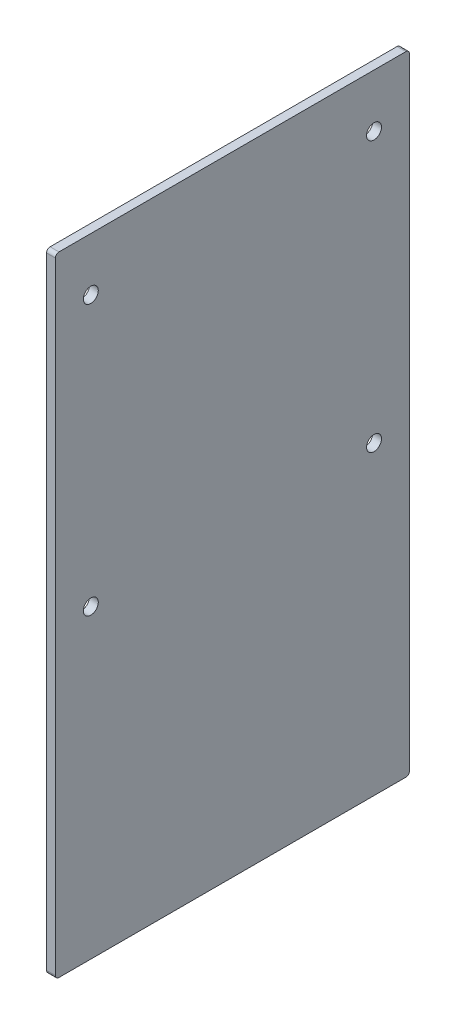
ISO-10303-21;
HEADER;
FILE_DESCRIPTION(('STEP AP214'),'2;1');
FILE_NAME('part.step','',(''),(''),'','','');
FILE_SCHEMA(('AUTOMOTIVE_DESIGN { 1 0 10303 214 1 1 1 1 }'));
ENDSEC;
DATA;
#1=APPLICATION_CONTEXT('core data for automotive mechanical design processes');
#2=APPLICATION_PROTOCOL_DEFINITION('international standard','automotive_design',2000,#1);
#3=PRODUCT_CONTEXT('',#1,'mechanical');
#4=PRODUCT('Part','Part','',(#3));
#5=PRODUCT_RELATED_PRODUCT_CATEGORY('part','',(#4));
#6=PRODUCT_DEFINITION_FORMATION('','',#4);
#7=PRODUCT_DEFINITION_CONTEXT('part definition',#1,'design');
#8=PRODUCT_DEFINITION('design','',#6,#7);
#9=PRODUCT_DEFINITION_SHAPE('','',#8);
#10=(LENGTH_UNIT() NAMED_UNIT(*) SI_UNIT(.MILLI.,.METRE.));
#11=(NAMED_UNIT(*) PLANE_ANGLE_UNIT() SI_UNIT($,.RADIAN.));
#12=(NAMED_UNIT(*) SI_UNIT($,.STERADIAN.) SOLID_ANGLE_UNIT());
#13=UNCERTAINTY_MEASURE_WITH_UNIT(LENGTH_MEASURE(1.E-05),#10,'distance_accuracy_value','');
#14=(GEOMETRIC_REPRESENTATION_CONTEXT(3) GLOBAL_UNCERTAINTY_ASSIGNED_CONTEXT((#13)) GLOBAL_UNIT_ASSIGNED_CONTEXT((#10,
#11,#12)) REPRESENTATION_CONTEXT('',''));
#15=CARTESIAN_POINT('',(0.,0.,0.));
#16=DIRECTION('',(0.,0.,1.));
#17=DIRECTION('',(1.,0.,0.));
#18=AXIS2_PLACEMENT_3D('',#15,#16,#17);
#19=CARTESIAN_POINT('',(6.35,0.,0.));
#20=DIRECTION('',(0.,0.,-1.));
#21=DIRECTION('',(-1.,0.,0.));
#22=AXIS2_PLACEMENT_3D('',#19,#20,#21);
#23=PLANE('',#22);
#24=DIRECTION('',(0.,-1.,0.));
#25=VECTOR('',#24,1.);
#26=CARTESIAN_POINT('',(6.35,0.,0.));
#27=LINE('',#26,#25);
#28=CARTESIAN_POINT('',(6.35,448.31,0.));
#29=VERTEX_POINT('',#28);
#30=CARTESIAN_POINT('',(6.35,2.54,0.));
#31=VERTEX_POINT('',#30);
#32=EDGE_CURVE('E167',#29,#31,#27,.T.);
#33=ORIENTED_EDGE('',*,*,#32,.F.);
#34=DIRECTION('',(1.,0.,0.));
#35=VECTOR('',#34,1.);
#36=CARTESIAN_POINT('',(0.,448.31,0.));
#37=LINE('',#36,#35);
#38=CARTESIAN_POINT('',(0.,448.31,0.));
#39=VERTEX_POINT('',#38);
#40=EDGE_CURVE('E190',#29,#39,#37,.F.);
#41=ORIENTED_EDGE('',*,*,#40,.T.);
#42=DIRECTION('',(0.,-1.,0.));
#43=VECTOR('',#42,1.);
#44=CARTESIAN_POINT('',(0.,0.,0.));
#45=LINE('',#44,#43);
#46=CARTESIAN_POINT('',(0.,2.54,0.));
#47=VERTEX_POINT('',#46);
#48=EDGE_CURVE('E162',#39,#47,#45,.T.);
#49=ORIENTED_EDGE('',*,*,#48,.T.);
#50=DIRECTION('',(-1.,0.,0.));
#51=VECTOR('',#50,1.);
#52=CARTESIAN_POINT('',(6.35,2.54,0.));
#53=LINE('',#52,#51);
#54=EDGE_CURVE('E187',#47,#31,#53,.F.);
#55=ORIENTED_EDGE('',*,*,#54,.T.);
#56=EDGE_LOOP('',(#33,#41,#49,#55));
#57=FACE_BOUND('',#56,.T.);
#58=ADVANCED_FACE('F40',(#57),#23,.F.);
#59=CARTESIAN_POINT('',(6.35,0.,0.));
#60=DIRECTION('',(0.,1.,0.));
#61=DIRECTION('',(0.,0.,1.));
#62=AXIS2_PLACEMENT_3D('',#59,#60,#61);
#63=PLANE('',#62);
#64=DIRECTION('',(0.,0.,-1.));
#65=VECTOR('',#64,1.);
#66=CARTESIAN_POINT('',(0.,0.,0.));
#67=LINE('',#66,#65);
#68=CARTESIAN_POINT('',(0.,0.,-2.54));
#69=VERTEX_POINT('',#68);
#70=CARTESIAN_POINT('',(0.,0.,-251.46));
#71=VERTEX_POINT('',#70);
#72=EDGE_CURVE('E154',#69,#71,#67,.T.);
#73=ORIENTED_EDGE('',*,*,#72,.T.);
#74=DIRECTION('',(-1.,0.,0.));
#75=VECTOR('',#74,1.);
#76=CARTESIAN_POINT('',(6.35,0.,-251.46));
#77=LINE('',#76,#75);
#78=CARTESIAN_POINT('',(6.35,0.,-251.46));
#79=VERTEX_POINT('',#78);
#80=EDGE_CURVE('E11',#71,#79,#77,.F.);
#81=ORIENTED_EDGE('',*,*,#80,.T.);
#82=DIRECTION('',(0.,0.,-1.));
#83=VECTOR('',#82,1.);
#84=CARTESIAN_POINT('',(6.35,0.,0.));
#85=LINE('',#84,#83);
#86=CARTESIAN_POINT('',(6.35,0.,-2.54));
#87=VERTEX_POINT('',#86);
#88=EDGE_CURVE('E157',#87,#79,#85,.T.);
#89=ORIENTED_EDGE('',*,*,#88,.F.);
#90=DIRECTION('',(-1.,0.,0.));
#91=VECTOR('',#90,1.);
#92=CARTESIAN_POINT('',(6.35,0.,-2.54));
#93=LINE('',#92,#91);
#94=EDGE_CURVE('E49',#87,#69,#93,.T.);
#95=ORIENTED_EDGE('',*,*,#94,.T.);
#96=EDGE_LOOP('',(#73,#81,#89,#95));
#97=FACE_BOUND('',#96,.T.);
#98=ADVANCED_FACE('F153',(#97),#63,.F.);
#99=CARTESIAN_POINT('',(6.35,0.,-254.));
#100=DIRECTION('',(0.,0.,1.));
#101=DIRECTION('',(1.,0.,0.));
#102=AXIS2_PLACEMENT_3D('',#99,#100,#101);
#103=PLANE('',#102);
#104=DIRECTION('',(0.,1.,0.));
#105=VECTOR('',#104,1.);
#106=CARTESIAN_POINT('',(0.,0.,-254.));
#107=LINE('',#106,#105);
#108=CARTESIAN_POINT('',(0.,2.54,-254.));
#109=VERTEX_POINT('',#108);
#110=CARTESIAN_POINT('',(0.,448.31,-254.));
#111=VERTEX_POINT('',#110);
#112=EDGE_CURVE('E161',#109,#111,#107,.T.);
#113=ORIENTED_EDGE('',*,*,#112,.T.);
#114=DIRECTION('',(1.,0.,0.));
#115=VECTOR('',#114,1.);
#116=CARTESIAN_POINT('',(6.35,448.31,-254.));
#117=LINE('',#116,#115);
#118=CARTESIAN_POINT('',(6.35,448.31,-254.));
#119=VERTEX_POINT('',#118);
#120=EDGE_CURVE('E134',#111,#119,#117,.T.);
#121=ORIENTED_EDGE('',*,*,#120,.T.);
#122=DIRECTION('',(0.,1.,0.));
#123=VECTOR('',#122,1.);
#124=CARTESIAN_POINT('',(6.35,0.,-254.));
#125=LINE('',#124,#123);
#126=CARTESIAN_POINT('',(6.35,2.54,-254.));
#127=VERTEX_POINT('',#126);
#128=EDGE_CURVE('E120',#127,#119,#125,.T.);
#129=ORIENTED_EDGE('',*,*,#128,.F.);
#130=DIRECTION('',(-1.,0.,0.));
#131=VECTOR('',#130,1.);
#132=CARTESIAN_POINT('',(6.35,2.54,-254.));
#133=LINE('',#132,#131);
#134=EDGE_CURVE('E140',#127,#109,#133,.T.);
#135=ORIENTED_EDGE('',*,*,#134,.T.);
#136=EDGE_LOOP('',(#113,#121,#129,#135));
#137=FACE_BOUND('',#136,.T.);
#138=ADVANCED_FACE('F252',(#137),#103,.F.);
#139=CARTESIAN_POINT('',(6.35,0.,0.));
#140=DIRECTION('',(-1.,0.,0.));
#141=DIRECTION('',(0.,0.,1.));
#142=AXIS2_PLACEMENT_3D('',#139,#140,#141);
#143=PLANE('',#142);
#144=CARTESIAN_POINT('',(6.35,412.75,-25.4));
#145=DIRECTION('',(1.,0.,0.));
#146=DIRECTION('',(0.,0.,-1.));
#147=AXIS2_PLACEMENT_3D('',#144,#145,#146);
#148=CIRCLE('',#147,5.35787599999998);
#149=CARTESIAN_POINT('',(6.35,412.75,-30.757876));
#150=VERTEX_POINT('',#149);
#151=EDGE_CURVE('E129',#150,#150,#148,.T.);
#152=ORIENTED_EDGE('',*,*,#151,.F.);
#153=EDGE_LOOP('',(#152));
#154=FACE_BOUND('',#153,.T.);
#155=CARTESIAN_POINT('',(6.35,219.075,-25.4));
#156=DIRECTION('',(1.,0.,0.));
#157=DIRECTION('',(0.,0.,-1.));
#158=AXIS2_PLACEMENT_3D('',#155,#156,#157);
#159=CIRCLE('',#158,5.35787600000001);
#160=CARTESIAN_POINT('',(6.35,219.075,-30.7578760000001));
#161=VERTEX_POINT('',#160);
#162=EDGE_CURVE('E236',#161,#161,#159,.T.);
#163=ORIENTED_EDGE('',*,*,#162,.F.);
#164=EDGE_LOOP('',(#163));
#165=FACE_BOUND('',#164,.T.);
#166=CARTESIAN_POINT('',(6.35,219.075,-228.6));
#167=DIRECTION('',(1.,0.,0.));
#168=DIRECTION('',(0.,0.,-1.));
#169=AXIS2_PLACEMENT_3D('',#166,#167,#168);
#170=CIRCLE('',#169,5.35787600000001);
#171=CARTESIAN_POINT('',(6.35,219.075,-233.957876));
#172=VERTEX_POINT('',#171);
#173=EDGE_CURVE('E228',#172,#172,#170,.T.);
#174=ORIENTED_EDGE('',*,*,#173,.F.);
#175=EDGE_LOOP('',(#174));
#176=FACE_BOUND('',#175,.T.);
#177=CARTESIAN_POINT('',(6.35,412.75,-228.6));
#178=DIRECTION('',(1.,0.,0.));
#179=DIRECTION('',(0.,0.,-1.));
#180=AXIS2_PLACEMENT_3D('',#177,#178,#179);
#181=CIRCLE('',#180,5.35787599999998);
#182=CARTESIAN_POINT('',(6.35,412.75,-233.957876));
#183=VERTEX_POINT('',#182);
#184=EDGE_CURVE('E220',#183,#183,#181,.T.);
#185=ORIENTED_EDGE('',*,*,#184,.F.);
#186=EDGE_LOOP('',(#185));
#187=FACE_BOUND('',#186,.T.);
#188=DIRECTION('',(0.,0.,1.));
#189=VECTOR('',#188,1.);
#190=CARTESIAN_POINT('',(6.35,450.85,0.));
#191=LINE('',#190,#189);
#192=CARTESIAN_POINT('',(6.35,450.85,-251.46));
#193=VERTEX_POINT('',#192);
#194=CARTESIAN_POINT('',(6.35,450.85,-2.54));
#195=VERTEX_POINT('',#194);
#196=EDGE_CURVE('E115',#193,#195,#191,.T.);
#197=ORIENTED_EDGE('',*,*,#196,.T.);
#198=CARTESIAN_POINT('',(6.35000000000002,448.31,-2.54));
#199=DIRECTION('',(-1.,0.,0.));
#200=DIRECTION('',(0.,0.,1.));
#201=AXIS2_PLACEMENT_3D('',#198,#199,#200);
#202=CIRCLE('',#201,2.54);
#203=EDGE_CURVE('E184',#195,#29,#202,.F.);
#204=ORIENTED_EDGE('',*,*,#203,.T.);
#205=ORIENTED_EDGE('',*,*,#32,.T.);
#206=CARTESIAN_POINT('',(6.35,2.54,-2.54));
#207=DIRECTION('',(-1.,0.,0.));
#208=DIRECTION('',(0.,0.,1.));
#209=AXIS2_PLACEMENT_3D('',#206,#207,#208);
#210=CIRCLE('',#209,2.54);
#211=EDGE_CURVE('E175',#31,#87,#210,.F.);
#212=ORIENTED_EDGE('',*,*,#211,.T.);
#213=ORIENTED_EDGE('',*,*,#88,.T.);
#214=CARTESIAN_POINT('',(6.35,2.54,-251.46));
#215=DIRECTION('',(-1.,0.,0.));
#216=DIRECTION('',(0.,0.,1.));
#217=AXIS2_PLACEMENT_3D('',#214,#215,#216);
#218=CIRCLE('',#217,2.54);
#219=EDGE_CURVE('E178',#79,#127,#218,.F.);
#220=ORIENTED_EDGE('',*,*,#219,.T.);
#221=ORIENTED_EDGE('',*,*,#128,.T.);
#222=CARTESIAN_POINT('',(6.35,448.31,-251.46));
#223=DIRECTION('',(-1.,0.,0.));
#224=DIRECTION('',(0.,0.,1.));
#225=AXIS2_PLACEMENT_3D('',#222,#223,#224);
#226=CIRCLE('',#225,2.54);
#227=EDGE_CURVE('E181',#119,#193,#226,.F.);
#228=ORIENTED_EDGE('',*,*,#227,.T.);
#229=EDGE_LOOP('',(#197,#204,#205,#212,#213,#220,#221,#228));
#230=FACE_BOUND('',#229,.T.);
#231=ADVANCED_FACE('F249',(#154,#165,#176,#187,#230),#143,.F.);
#232=CARTESIAN_POINT('',(0.,0.,0.));
#233=DIRECTION('',(-1.,0.,0.));
#234=DIRECTION('',(0.,0.,1.));
#235=AXIS2_PLACEMENT_3D('',#232,#233,#234);
#236=PLANE('',#235);
#237=CARTESIAN_POINT('',(0.,412.75,-25.4));
#238=DIRECTION('',(1.,0.,0.));
#239=DIRECTION('',(0.,0.,-1.));
#240=AXIS2_PLACEMENT_3D('',#237,#238,#239);
#241=CIRCLE('',#240,5.35787599999998);
#242=CARTESIAN_POINT('',(0.,412.75,-30.757876));
#243=VERTEX_POINT('',#242);
#244=EDGE_CURVE('E240',#243,#243,#241,.T.);
#245=ORIENTED_EDGE('',*,*,#244,.T.);
#246=EDGE_LOOP('',(#245));
#247=FACE_BOUND('',#246,.T.);
#248=CARTESIAN_POINT('',(0.,219.075,-25.4));
#249=DIRECTION('',(1.,0.,0.));
#250=DIRECTION('',(0.,0.,-1.));
#251=AXIS2_PLACEMENT_3D('',#248,#249,#250);
#252=CIRCLE('',#251,5.35787600000001);
#253=CARTESIAN_POINT('',(0.,219.075,-30.7578760000001));
#254=VERTEX_POINT('',#253);
#255=EDGE_CURVE('E232',#254,#254,#252,.T.);
#256=ORIENTED_EDGE('',*,*,#255,.T.);
#257=EDGE_LOOP('',(#256));
#258=FACE_BOUND('',#257,.T.);
#259=CARTESIAN_POINT('',(0.,219.075,-228.6));
#260=DIRECTION('',(1.,0.,0.));
#261=DIRECTION('',(0.,0.,-1.));
#262=AXIS2_PLACEMENT_3D('',#259,#260,#261);
#263=CIRCLE('',#262,5.35787599999998);
#264=CARTESIAN_POINT('',(0.,219.075,-233.957876));
#265=VERTEX_POINT('',#264);
#266=EDGE_CURVE('E224',#265,#265,#263,.T.);
#267=ORIENTED_EDGE('',*,*,#266,.T.);
#268=EDGE_LOOP('',(#267));
#269=FACE_BOUND('',#268,.T.);
#270=CARTESIAN_POINT('',(0.,412.75,-228.6));
#271=DIRECTION('',(1.,0.,0.));
#272=DIRECTION('',(0.,0.,-1.));
#273=AXIS2_PLACEMENT_3D('',#270,#271,#272);
#274=CIRCLE('',#273,5.35787599999998);
#275=CARTESIAN_POINT('',(0.,412.75,-233.957876));
#276=VERTEX_POINT('',#275);
#277=EDGE_CURVE('E169',#276,#276,#274,.T.);
#278=ORIENTED_EDGE('',*,*,#277,.T.);
#279=EDGE_LOOP('',(#278));
#280=FACE_BOUND('',#279,.T.);
#281=ORIENTED_EDGE('',*,*,#48,.F.);
#282=CARTESIAN_POINT('',(0.,448.31,-2.54));
#283=DIRECTION('',(-1.,0.,0.));
#284=DIRECTION('',(0.,0.,1.));
#285=AXIS2_PLACEMENT_3D('',#282,#283,#284);
#286=CIRCLE('',#285,2.54);
#287=CARTESIAN_POINT('',(0.,450.85,-2.54));
#288=VERTEX_POINT('',#287);
#289=EDGE_CURVE('E127',#39,#288,#286,.T.);
#290=ORIENTED_EDGE('',*,*,#289,.T.);
#291=DIRECTION('',(0.,0.,1.));
#292=VECTOR('',#291,1.);
#293=CARTESIAN_POINT('',(0.,450.85,0.));
#294=LINE('',#293,#292);
#295=CARTESIAN_POINT('',(0.,450.85,-251.46));
#296=VERTEX_POINT('',#295);
#297=EDGE_CURVE('E112',#296,#288,#294,.T.);
#298=ORIENTED_EDGE('',*,*,#297,.F.);
#299=CARTESIAN_POINT('',(0.,448.31,-251.46));
#300=DIRECTION('',(-1.,0.,0.));
#301=DIRECTION('',(0.,0.,1.));
#302=AXIS2_PLACEMENT_3D('',#299,#300,#301);
#303=CIRCLE('',#302,2.54);
#304=EDGE_CURVE('E124',#296,#111,#303,.T.);
#305=ORIENTED_EDGE('',*,*,#304,.T.);
#306=ORIENTED_EDGE('',*,*,#112,.F.);
#307=CARTESIAN_POINT('',(0.,2.54,-251.46));
#308=DIRECTION('',(-1.,0.,0.));
#309=DIRECTION('',(0.,0.,1.));
#310=AXIS2_PLACEMENT_3D('',#307,#308,#309);
#311=CIRCLE('',#310,2.54);
#312=EDGE_CURVE('E56',#109,#71,#311,.T.);
#313=ORIENTED_EDGE('',*,*,#312,.T.);
#314=ORIENTED_EDGE('',*,*,#72,.F.);
#315=CARTESIAN_POINT('',(0.,2.54,-2.54));
#316=DIRECTION('',(-1.,0.,0.));
#317=DIRECTION('',(0.,0.,1.));
#318=AXIS2_PLACEMENT_3D('',#315,#316,#317);
#319=CIRCLE('',#318,2.54);
#320=EDGE_CURVE('E64',#69,#47,#319,.T.);
#321=ORIENTED_EDGE('',*,*,#320,.T.);
#322=EDGE_LOOP('',(#281,#290,#298,#305,#306,#313,#314,#321));
#323=FACE_BOUND('',#322,.T.);
#324=ADVANCED_FACE('F123',(#247,#258,#269,#280,#323),#236,.T.);
#325=CARTESIAN_POINT('',(6.35,412.75,-228.6));
#326=DIRECTION('',(1.,0.,0.));
#327=DIRECTION('',(0.,0.,-1.));
#328=AXIS2_PLACEMENT_3D('',#325,#326,#327);
#329=CYLINDRICAL_SURFACE('',#328,5.35787599999998);
#330=ORIENTED_EDGE('',*,*,#277,.F.);
#331=EDGE_LOOP('',(#330));
#332=FACE_BOUND('',#331,.T.);
#333=ORIENTED_EDGE('',*,*,#184,.T.);
#334=EDGE_LOOP('',(#333));
#335=FACE_BOUND('',#334,.T.);
#336=ADVANCED_FACE('F281',(#332,#335),#329,.F.);
#337=CARTESIAN_POINT('',(6.35,219.075,-228.6));
#338=DIRECTION('',(1.,0.,0.));
#339=DIRECTION('',(0.,0.,-1.));
#340=AXIS2_PLACEMENT_3D('',#337,#338,#339);
#341=CYLINDRICAL_SURFACE('',#340,5.357876);
#342=ORIENTED_EDGE('',*,*,#266,.F.);
#343=EDGE_LOOP('',(#342));
#344=FACE_BOUND('',#343,.T.);
#345=ORIENTED_EDGE('',*,*,#173,.T.);
#346=EDGE_LOOP('',(#345));
#347=FACE_BOUND('',#346,.T.);
#348=ADVANCED_FACE('F288',(#344,#347),#341,.F.);
#349=CARTESIAN_POINT('',(6.35,219.075,-25.4));
#350=DIRECTION('',(1.,0.,0.));
#351=DIRECTION('',(0.,0.,-1.));
#352=AXIS2_PLACEMENT_3D('',#349,#350,#351);
#353=CYLINDRICAL_SURFACE('',#352,5.35787600000001);
#354=ORIENTED_EDGE('',*,*,#255,.F.);
#355=EDGE_LOOP('',(#354));
#356=FACE_BOUND('',#355,.T.);
#357=ORIENTED_EDGE('',*,*,#162,.T.);
#358=EDGE_LOOP('',(#357));
#359=FACE_BOUND('',#358,.T.);
#360=ADVANCED_FACE('F292',(#356,#359),#353,.F.);
#361=CARTESIAN_POINT('',(6.35,412.75,-25.4));
#362=DIRECTION('',(1.,0.,0.));
#363=DIRECTION('',(0.,0.,-1.));
#364=AXIS2_PLACEMENT_3D('',#361,#362,#363);
#365=CYLINDRICAL_SURFACE('',#364,5.35787599999998);
#366=ORIENTED_EDGE('',*,*,#244,.F.);
#367=EDGE_LOOP('',(#366));
#368=FACE_BOUND('',#367,.T.);
#369=ORIENTED_EDGE('',*,*,#151,.T.);
#370=EDGE_LOOP('',(#369));
#371=FACE_BOUND('',#370,.T.);
#372=ADVANCED_FACE('F268',(#368,#371),#365,.F.);
#373=CARTESIAN_POINT('',(-254.31730181016,450.85,0.));
#374=DIRECTION('',(0.,1.,0.));
#375=DIRECTION('',(0.,0.,1.));
#376=AXIS2_PLACEMENT_3D('',#373,#374,#375);
#377=PLANE('',#376);
#378=ORIENTED_EDGE('',*,*,#297,.T.);
#379=DIRECTION('',(1.,0.,0.));
#380=VECTOR('',#379,1.);
#381=CARTESIAN_POINT('',(6.35000000000002,450.85,-2.54));
#382=LINE('',#381,#380);
#383=EDGE_CURVE('E119',#288,#195,#382,.T.);
#384=ORIENTED_EDGE('',*,*,#383,.T.);
#385=ORIENTED_EDGE('',*,*,#196,.F.);
#386=DIRECTION('',(1.,0.,0.));
#387=VECTOR('',#386,1.);
#388=CARTESIAN_POINT('',(0.,450.85,-251.46));
#389=LINE('',#388,#387);
#390=EDGE_CURVE('E108',#193,#296,#389,.F.);
#391=ORIENTED_EDGE('',*,*,#390,.T.);
#392=EDGE_LOOP('',(#378,#384,#385,#391));
#393=FACE_BOUND('',#392,.T.);
#394=ADVANCED_FACE('F110',(#393),#377,.T.);
#395=CARTESIAN_POINT('',(-254.31730181016,448.31,-2.54));
#396=DIRECTION('',(-1.,0.,0.));
#397=DIRECTION('',(0.,0.,1.));
#398=AXIS2_PLACEMENT_3D('',#395,#396,#397);
#399=CYLINDRICAL_SURFACE('',#398,2.54);
#400=ORIENTED_EDGE('',*,*,#289,.F.);
#401=ORIENTED_EDGE('',*,*,#40,.F.);
#402=ORIENTED_EDGE('',*,*,#203,.F.);
#403=ORIENTED_EDGE('',*,*,#383,.F.);
#404=EDGE_LOOP('',(#400,#401,#402,#403));
#405=FACE_BOUND('',#404,.T.);
#406=ADVANCED_FACE('F260',(#405),#399,.T.);
#407=CARTESIAN_POINT('',(6.35,448.31,-251.46));
#408=DIRECTION('',(-1.,0.,0.));
#409=DIRECTION('',(0.,0.,1.));
#410=AXIS2_PLACEMENT_3D('',#407,#408,#409);
#411=CYLINDRICAL_SURFACE('',#410,2.54);
#412=ORIENTED_EDGE('',*,*,#304,.F.);
#413=ORIENTED_EDGE('',*,*,#390,.F.);
#414=ORIENTED_EDGE('',*,*,#227,.F.);
#415=ORIENTED_EDGE('',*,*,#120,.F.);
#416=EDGE_LOOP('',(#412,#413,#414,#415));
#417=FACE_BOUND('',#416,.T.);
#418=ADVANCED_FACE('F132',(#417),#411,.T.);
#419=CARTESIAN_POINT('',(6.35,2.54,-251.46));
#420=DIRECTION('',(-1.,0.,0.));
#421=DIRECTION('',(0.,0.,1.));
#422=AXIS2_PLACEMENT_3D('',#419,#420,#421);
#423=CYLINDRICAL_SURFACE('',#422,2.54);
#424=ORIENTED_EDGE('',*,*,#219,.F.);
#425=ORIENTED_EDGE('',*,*,#80,.F.);
#426=ORIENTED_EDGE('',*,*,#312,.F.);
#427=ORIENTED_EDGE('',*,*,#134,.F.);
#428=EDGE_LOOP('',(#424,#425,#426,#427));
#429=FACE_BOUND('',#428,.T.);
#430=ADVANCED_FACE('F256',(#429),#423,.T.);
#431=CARTESIAN_POINT('',(6.35,2.54,-2.54));
#432=DIRECTION('',(-1.,0.,0.));
#433=DIRECTION('',(0.,0.,1.));
#434=AXIS2_PLACEMENT_3D('',#431,#432,#433);
#435=CYLINDRICAL_SURFACE('',#434,2.54);
#436=ORIENTED_EDGE('',*,*,#211,.F.);
#437=ORIENTED_EDGE('',*,*,#54,.F.);
#438=ORIENTED_EDGE('',*,*,#320,.F.);
#439=ORIENTED_EDGE('',*,*,#94,.F.);
#440=EDGE_LOOP('',(#436,#437,#438,#439));
#441=FACE_BOUND('',#440,.T.);
#442=ADVANCED_FACE('F42',(#441),#435,.T.);
#443=CLOSED_SHELL('',(#58,#98,#138,#231,#324,#336,#348,#360,#372,#394,#406,#418,#430,#442));
#444=MANIFOLD_SOLID_BREP('B2',#443);
#445=ADVANCED_BREP_SHAPE_REPRESENTATION('',(#18,#444),#14);
#446=SHAPE_DEFINITION_REPRESENTATION(#9,#445);
ENDSEC;
END-ISO-10303-21;
